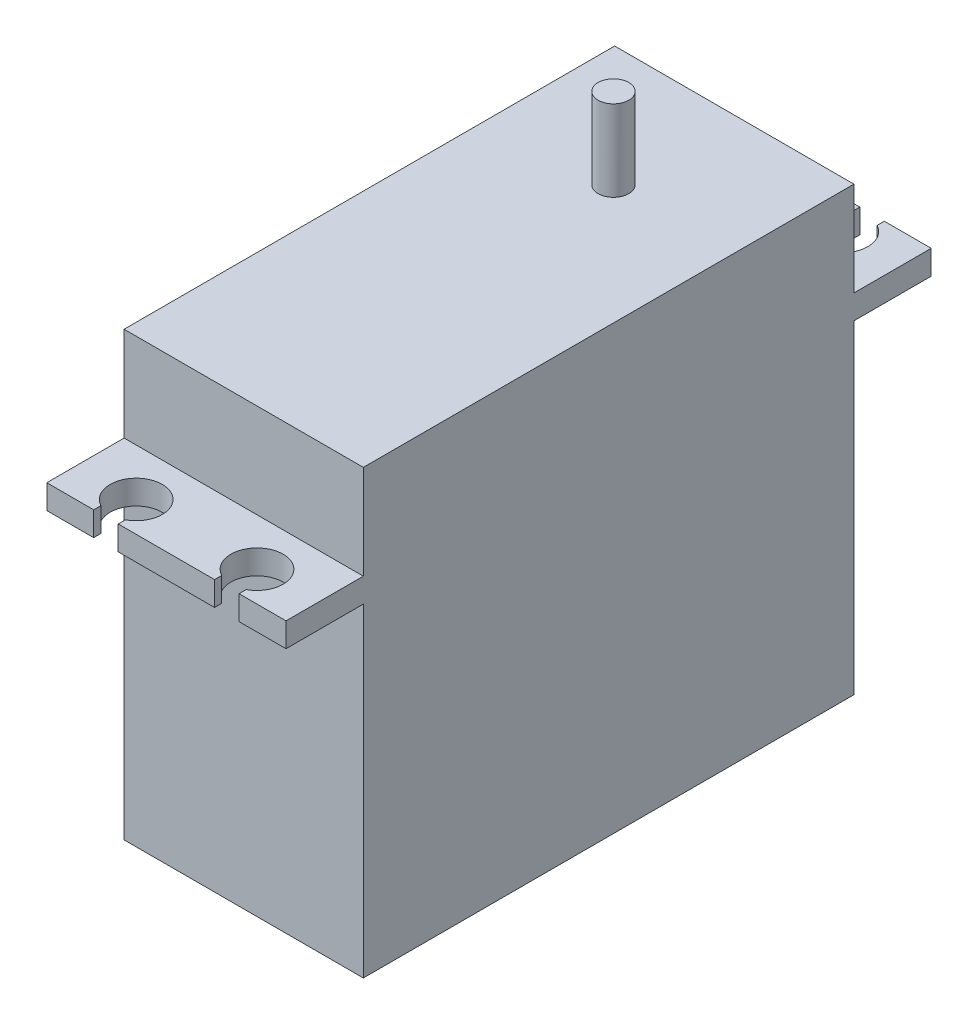
ISO-10303-21;
HEADER;
FILE_DESCRIPTION(('STEP AP214'),'2;1');
FILE_NAME('part.step','',(''),(''),'','','');
FILE_SCHEMA(('AUTOMOTIVE_DESIGN { 1 0 10303 214 1 1 1 1 }'));
ENDSEC;
DATA;
#1=APPLICATION_CONTEXT('core data for automotive mechanical design processes');
#2=APPLICATION_PROTOCOL_DEFINITION('international standard','automotive_design',2000,#1);
#3=PRODUCT_CONTEXT('',#1,'mechanical');
#4=PRODUCT('Part','Part','',(#3));
#5=PRODUCT_RELATED_PRODUCT_CATEGORY('part','',(#4));
#6=PRODUCT_DEFINITION_FORMATION('','',#4);
#7=PRODUCT_DEFINITION_CONTEXT('part definition',#1,'design');
#8=PRODUCT_DEFINITION('design','',#6,#7);
#9=PRODUCT_DEFINITION_SHAPE('','',#8);
#10=(LENGTH_UNIT() NAMED_UNIT(*) SI_UNIT(.MILLI.,.METRE.));
#11=(NAMED_UNIT(*) PLANE_ANGLE_UNIT() SI_UNIT($,.RADIAN.));
#12=(NAMED_UNIT(*) SI_UNIT($,.STERADIAN.) SOLID_ANGLE_UNIT());
#13=UNCERTAINTY_MEASURE_WITH_UNIT(LENGTH_MEASURE(1.E-05),#10,'distance_accuracy_value','');
#14=(GEOMETRIC_REPRESENTATION_CONTEXT(3) GLOBAL_UNCERTAINTY_ASSIGNED_CONTEXT((#13)) GLOBAL_UNIT_ASSIGNED_CONTEXT((#10,
#11,#12)) REPRESENTATION_CONTEXT('',''));
#15=CARTESIAN_POINT('',(0.,0.,0.));
#16=DIRECTION('',(0.,0.,1.));
#17=DIRECTION('',(1.,0.,0.));
#18=AXIS2_PLACEMENT_3D('',#15,#16,#17);
#19=CARTESIAN_POINT('',(0.,0.,-26.7));
#20=DIRECTION('',(0.,0.,-1.));
#21=DIRECTION('',(-1.,0.,0.));
#22=AXIS2_PLACEMENT_3D('',#19,#20,#21);
#23=PLANE('',#22);
#24=DIRECTION('',(0.,1.,0.));
#25=VECTOR('',#24,1.);
#26=CARTESIAN_POINT('',(3.984,0.,-26.7));
#27=LINE('',#26,#25);
#28=CARTESIAN_POINT('',(3.984,26.8,-26.7));
#29=VERTEX_POINT('',#28);
#30=CARTESIAN_POINT('',(3.984,28.8,-26.7));
#31=VERTEX_POINT('',#30);
#32=EDGE_CURVE('E42',#29,#31,#27,.T.);
#33=ORIENTED_EDGE('',*,*,#32,.F.);
#34=DIRECTION('',(-1.,0.,0.));
#35=VECTOR('',#34,1.);
#36=CARTESIAN_POINT('',(9.9,26.8,-26.7));
#37=LINE('',#36,#35);
#38=CARTESIAN_POINT('',(-3.984,26.8,-26.7));
#39=VERTEX_POINT('',#38);
#40=EDGE_CURVE('E335',#29,#39,#37,.T.);
#41=ORIENTED_EDGE('',*,*,#40,.T.);
#42=DIRECTION('',(0.,-1.,0.));
#43=VECTOR('',#42,1.);
#44=CARTESIAN_POINT('',(-3.984,0.,-26.7));
#45=LINE('',#44,#43);
#46=CARTESIAN_POINT('',(-3.984,28.8,-26.7));
#47=VERTEX_POINT('',#46);
#48=EDGE_CURVE('E399',#47,#39,#45,.T.);
#49=ORIENTED_EDGE('',*,*,#48,.F.);
#50=DIRECTION('',(1.,0.,0.));
#51=VECTOR('',#50,1.);
#52=CARTESIAN_POINT('',(9.9,28.8,-26.7));
#53=LINE('',#52,#51);
#54=EDGE_CURVE('E342',#47,#31,#53,.T.);
#55=ORIENTED_EDGE('',*,*,#54,.T.);
#56=EDGE_LOOP('',(#33,#41,#49,#55));
#57=FACE_BOUND('',#56,.T.);
#58=ADVANCED_FACE('F34',(#57),#23,.T.);
#59=CARTESIAN_POINT('',(0.,0.,26.7));
#60=DIRECTION('',(0.,0.,1.));
#61=DIRECTION('',(1.,0.,0.));
#62=AXIS2_PLACEMENT_3D('',#59,#60,#61);
#63=PLANE('',#62);
#64=DIRECTION('',(0.,1.,0.));
#65=VECTOR('',#64,1.);
#66=CARTESIAN_POINT('',(-3.984,0.,26.7));
#67=LINE('',#66,#65);
#68=CARTESIAN_POINT('',(-3.984,26.8,26.7));
#69=VERTEX_POINT('',#68);
#70=CARTESIAN_POINT('',(-3.984,28.8,26.7));
#71=VERTEX_POINT('',#70);
#72=EDGE_CURVE('E412',#69,#71,#67,.T.);
#73=ORIENTED_EDGE('',*,*,#72,.F.);
#74=DIRECTION('',(1.,0.,0.));
#75=VECTOR('',#74,1.);
#76=CARTESIAN_POINT('',(-9.9,26.8,26.7));
#77=LINE('',#76,#75);
#78=CARTESIAN_POINT('',(3.984,26.8,26.7));
#79=VERTEX_POINT('',#78);
#80=EDGE_CURVE('E302',#69,#79,#77,.T.);
#81=ORIENTED_EDGE('',*,*,#80,.T.);
#82=DIRECTION('',(0.,-1.,0.));
#83=VECTOR('',#82,1.);
#84=CARTESIAN_POINT('',(3.984,0.,26.7));
#85=LINE('',#84,#83);
#86=CARTESIAN_POINT('',(3.984,28.8,26.7));
#87=VERTEX_POINT('',#86);
#88=EDGE_CURVE('E227',#87,#79,#85,.T.);
#89=ORIENTED_EDGE('',*,*,#88,.F.);
#90=DIRECTION('',(-1.,0.,0.));
#91=VECTOR('',#90,1.);
#92=CARTESIAN_POINT('',(-9.9,28.8,26.7));
#93=LINE('',#92,#91);
#94=EDGE_CURVE('E309',#87,#71,#93,.T.);
#95=ORIENTED_EDGE('',*,*,#94,.T.);
#96=EDGE_LOOP('',(#73,#81,#89,#95));
#97=FACE_BOUND('',#96,.T.);
#98=ADVANCED_FACE('F474',(#97),#63,.T.);
#99=DIRECTION('',(0.,1.,0.));
#100=VECTOR('',#99,1.);
#101=CARTESIAN_POINT('',(6.016,0.,26.7));
#102=LINE('',#101,#100);
#103=CARTESIAN_POINT('',(6.016,26.8,26.7));
#104=VERTEX_POINT('',#103);
#105=CARTESIAN_POINT('',(6.016,28.8,26.7));
#106=VERTEX_POINT('',#105);
#107=EDGE_CURVE('E408',#104,#106,#102,.T.);
#108=ORIENTED_EDGE('',*,*,#107,.F.);
#109=CARTESIAN_POINT('',(9.9,26.8,26.7));
#110=VERTEX_POINT('',#109);
#111=EDGE_CURVE('E296',#104,#110,#77,.T.);
#112=ORIENTED_EDGE('',*,*,#111,.T.);
#113=DIRECTION('',(0.,1.,0.));
#114=VECTOR('',#113,1.);
#115=CARTESIAN_POINT('',(9.9,28.8,26.7));
#116=LINE('',#115,#114);
#117=CARTESIAN_POINT('',(9.9,28.8,26.7));
#118=VERTEX_POINT('',#117);
#119=EDGE_CURVE('E301',#110,#118,#116,.T.);
#120=ORIENTED_EDGE('',*,*,#119,.T.);
#121=EDGE_CURVE('E305',#118,#106,#93,.T.);
#122=ORIENTED_EDGE('',*,*,#121,.T.);
#123=EDGE_LOOP('',(#108,#112,#120,#122));
#124=FACE_BOUND('',#123,.T.);
#125=ADVANCED_FACE('F493',(#124),#63,.T.);
#126=DIRECTION('',(0.,1.,0.));
#127=VECTOR('',#126,1.);
#128=CARTESIAN_POINT('',(-6.016,0.,-26.7));
#129=LINE('',#128,#127);
#130=CARTESIAN_POINT('',(-6.016,26.8,-26.7));
#131=VERTEX_POINT('',#130);
#132=CARTESIAN_POINT('',(-6.016,28.8,-26.7));
#133=VERTEX_POINT('',#132);
#134=EDGE_CURVE('E402',#131,#133,#129,.T.);
#135=ORIENTED_EDGE('',*,*,#134,.F.);
#136=CARTESIAN_POINT('',(-9.9,26.8,-26.7));
#137=VERTEX_POINT('',#136);
#138=EDGE_CURVE('E329',#131,#137,#37,.T.);
#139=ORIENTED_EDGE('',*,*,#138,.T.);
#140=DIRECTION('',(0.,1.,0.));
#141=VECTOR('',#140,1.);
#142=CARTESIAN_POINT('',(-9.9,28.8,-26.7));
#143=LINE('',#142,#141);
#144=CARTESIAN_POINT('',(-9.9,28.8,-26.7));
#145=VERTEX_POINT('',#144);
#146=EDGE_CURVE('E334',#137,#145,#143,.T.);
#147=ORIENTED_EDGE('',*,*,#146,.T.);
#148=EDGE_CURVE('E338',#145,#133,#53,.T.);
#149=ORIENTED_EDGE('',*,*,#148,.T.);
#150=EDGE_LOOP('',(#135,#139,#147,#149));
#151=FACE_BOUND('',#150,.T.);
#152=ADVANCED_FACE('F513',(#151),#23,.T.);
#153=CARTESIAN_POINT('',(-9.9,36.6,20.3));
#154=DIRECTION('',(0.,0.,-1.));
#155=DIRECTION('',(-1.,0.,0.));
#156=AXIS2_PLACEMENT_3D('',#153,#154,#155);
#157=PLANE('',#156);
#158=DIRECTION('',(-1.,0.,0.));
#159=VECTOR('',#158,1.);
#160=CARTESIAN_POINT('',(-9.9,28.8,20.3));
#161=LINE('',#160,#159);
#162=CARTESIAN_POINT('',(9.9,28.8,20.3));
#163=VERTEX_POINT('',#162);
#164=CARTESIAN_POINT('',(-9.9,28.8,20.3));
#165=VERTEX_POINT('',#164);
#166=EDGE_CURVE('E297',#163,#165,#161,.T.);
#167=ORIENTED_EDGE('',*,*,#166,.F.);
#168=DIRECTION('',(0.,-1.,0.));
#169=VECTOR('',#168,1.);
#170=CARTESIAN_POINT('',(9.9,36.6,20.3));
#171=LINE('',#170,#169);
#172=CARTESIAN_POINT('',(9.9,36.6,20.3));
#173=VERTEX_POINT('',#172);
#174=EDGE_CURVE('E383',#173,#163,#171,.T.);
#175=ORIENTED_EDGE('',*,*,#174,.F.);
#176=DIRECTION('',(1.,0.,0.));
#177=VECTOR('',#176,1.);
#178=CARTESIAN_POINT('',(-9.9,36.6,20.3));
#179=LINE('',#178,#177);
#180=CARTESIAN_POINT('',(-9.9,36.6,20.3));
#181=VERTEX_POINT('',#180);
#182=EDGE_CURVE('E370',#181,#173,#179,.T.);
#183=ORIENTED_EDGE('',*,*,#182,.F.);
#184=DIRECTION('',(0.,-1.,0.));
#185=VECTOR('',#184,1.);
#186=CARTESIAN_POINT('',(-9.9,36.6,20.3));
#187=LINE('',#186,#185);
#188=EDGE_CURVE('E387',#181,#165,#187,.T.);
#189=ORIENTED_EDGE('',*,*,#188,.T.);
#190=EDGE_LOOP('',(#167,#175,#183,#189));
#191=FACE_BOUND('',#190,.T.);
#192=ADVANCED_FACE('F521',(#191),#157,.F.);
#193=DIRECTION('',(1.,0.,0.));
#194=VECTOR('',#193,1.);
#195=CARTESIAN_POINT('',(-9.9,26.8,20.3));
#196=LINE('',#195,#194);
#197=CARTESIAN_POINT('',(-9.9,26.8,20.3));
#198=VERTEX_POINT('',#197);
#199=CARTESIAN_POINT('',(9.9,26.8,20.3));
#200=VERTEX_POINT('',#199);
#201=EDGE_CURVE('E292',#198,#200,#196,.T.);
#202=ORIENTED_EDGE('',*,*,#201,.F.);
#203=CARTESIAN_POINT('',(-9.9,0.,20.3));
#204=VERTEX_POINT('',#203);
#205=EDGE_CURVE('E386',#198,#204,#187,.T.);
#206=ORIENTED_EDGE('',*,*,#205,.T.);
#207=DIRECTION('',(1.,0.,0.));
#208=VECTOR('',#207,1.);
#209=CARTESIAN_POINT('',(-9.9,0.,20.3));
#210=LINE('',#209,#208);
#211=CARTESIAN_POINT('',(9.9,0.,20.3));
#212=VERTEX_POINT('',#211);
#213=EDGE_CURVE('E366',#204,#212,#210,.T.);
#214=ORIENTED_EDGE('',*,*,#213,.T.);
#215=EDGE_CURVE('E372',#200,#212,#171,.T.);
#216=ORIENTED_EDGE('',*,*,#215,.F.);
#217=EDGE_LOOP('',(#202,#206,#214,#216));
#218=FACE_BOUND('',#217,.T.);
#219=ADVANCED_FACE('F551',(#218),#157,.F.);
#220=CARTESIAN_POINT('',(-9.9,36.6,-20.3));
#221=DIRECTION('',(0.,0.,1.));
#222=DIRECTION('',(1.,0.,0.));
#223=AXIS2_PLACEMENT_3D('',#220,#221,#222);
#224=PLANE('',#223);
#225=DIRECTION('',(1.,0.,0.));
#226=VECTOR('',#225,1.);
#227=CARTESIAN_POINT('',(9.9,28.8,-20.3));
#228=LINE('',#227,#226);
#229=CARTESIAN_POINT('',(-9.9,28.8,-20.3));
#230=VERTEX_POINT('',#229);
#231=CARTESIAN_POINT('',(9.9,28.8,-20.3));
#232=VERTEX_POINT('',#231);
#233=EDGE_CURVE('E330',#230,#232,#228,.T.);
#234=ORIENTED_EDGE('',*,*,#233,.F.);
#235=DIRECTION('',(0.,-1.,0.));
#236=VECTOR('',#235,1.);
#237=CARTESIAN_POINT('',(-9.9,36.6,-20.3));
#238=LINE('',#237,#236);
#239=CARTESIAN_POINT('',(-9.9,36.6,-20.3));
#240=VERTEX_POINT('',#239);
#241=EDGE_CURVE('E390',#240,#230,#238,.T.);
#242=ORIENTED_EDGE('',*,*,#241,.F.);
#243=DIRECTION('',(-1.,0.,0.));
#244=VECTOR('',#243,1.);
#245=CARTESIAN_POINT('',(-9.9,36.6,-20.3));
#246=LINE('',#245,#244);
#247=CARTESIAN_POINT('',(9.9,36.6,-20.3));
#248=VERTEX_POINT('',#247);
#249=EDGE_CURVE('E365',#248,#240,#246,.T.);
#250=ORIENTED_EDGE('',*,*,#249,.F.);
#251=DIRECTION('',(0.,-1.,0.));
#252=VECTOR('',#251,1.);
#253=CARTESIAN_POINT('',(9.9,36.6,-20.3));
#254=LINE('',#253,#252);
#255=EDGE_CURVE('E394',#248,#232,#254,.T.);
#256=ORIENTED_EDGE('',*,*,#255,.T.);
#257=EDGE_LOOP('',(#234,#242,#250,#256));
#258=FACE_BOUND('',#257,.T.);
#259=ADVANCED_FACE('F554',(#258),#224,.F.);
#260=DIRECTION('',(-1.,0.,0.));
#261=VECTOR('',#260,1.);
#262=CARTESIAN_POINT('',(9.9,26.8,-20.3));
#263=LINE('',#262,#261);
#264=CARTESIAN_POINT('',(9.9,26.8,-20.3));
#265=VERTEX_POINT('',#264);
#266=CARTESIAN_POINT('',(-9.9,26.8,-20.3));
#267=VERTEX_POINT('',#266);
#268=EDGE_CURVE('E325',#265,#267,#263,.T.);
#269=ORIENTED_EDGE('',*,*,#268,.F.);
#270=CARTESIAN_POINT('',(9.9,0.,-20.3));
#271=VERTEX_POINT('',#270);
#272=EDGE_CURVE('E393',#265,#271,#254,.T.);
#273=ORIENTED_EDGE('',*,*,#272,.T.);
#274=DIRECTION('',(-1.,0.,0.));
#275=VECTOR('',#274,1.);
#276=CARTESIAN_POINT('',(-9.9,0.,-20.3));
#277=LINE('',#276,#275);
#278=CARTESIAN_POINT('',(-9.9,0.,-20.3));
#279=VERTEX_POINT('',#278);
#280=EDGE_CURVE('E375',#271,#279,#277,.T.);
#281=ORIENTED_EDGE('',*,*,#280,.T.);
#282=EDGE_CURVE('E389',#267,#279,#238,.T.);
#283=ORIENTED_EDGE('',*,*,#282,.F.);
#284=EDGE_LOOP('',(#269,#273,#281,#283));
#285=FACE_BOUND('',#284,.T.);
#286=ADVANCED_FACE('F556',(#285),#224,.F.);
#287=CARTESIAN_POINT('',(9.9,36.6,20.3));
#288=DIRECTION('',(-1.,0.,0.));
#289=DIRECTION('',(0.,0.,1.));
#290=AXIS2_PLACEMENT_3D('',#287,#288,#289);
#291=PLANE('',#290);
#292=DIRECTION('',(0.,0.,-1.));
#293=VECTOR('',#292,1.);
#294=CARTESIAN_POINT('',(9.9,0.,20.3));
#295=LINE('',#294,#293);
#296=EDGE_CURVE('E361',#212,#271,#295,.T.);
#297=ORIENTED_EDGE('',*,*,#296,.T.);
#298=ORIENTED_EDGE('',*,*,#272,.F.);
#299=DIRECTION('',(0.,0.,1.));
#300=VECTOR('',#299,1.);
#301=CARTESIAN_POINT('',(9.9,26.8,-26.7));
#302=LINE('',#301,#300);
#303=CARTESIAN_POINT('',(9.9,26.8,-26.7));
#304=VERTEX_POINT('',#303);
#305=EDGE_CURVE('E355',#304,#265,#302,.T.);
#306=ORIENTED_EDGE('',*,*,#305,.F.);
#307=DIRECTION('',(0.,-1.,0.));
#308=VECTOR('',#307,1.);
#309=CARTESIAN_POINT('',(9.9,28.8,-26.7));
#310=LINE('',#309,#308);
#311=CARTESIAN_POINT('',(9.9,28.8,-26.7));
#312=VERTEX_POINT('',#311);
#313=EDGE_CURVE('E326',#312,#304,#310,.T.);
#314=ORIENTED_EDGE('',*,*,#313,.F.);
#315=DIRECTION('',(0.,0.,1.));
#316=VECTOR('',#315,1.);
#317=CARTESIAN_POINT('',(9.9,28.8,-26.7));
#318=LINE('',#317,#316);
#319=EDGE_CURVE('E341',#312,#232,#318,.T.);
#320=ORIENTED_EDGE('',*,*,#319,.T.);
#321=ORIENTED_EDGE('',*,*,#255,.F.);
#322=DIRECTION('',(0.,0.,-1.));
#323=VECTOR('',#322,1.);
#324=CARTESIAN_POINT('',(9.9,36.6,20.3));
#325=LINE('',#324,#323);
#326=EDGE_CURVE('E362',#173,#248,#325,.T.);
#327=ORIENTED_EDGE('',*,*,#326,.F.);
#328=ORIENTED_EDGE('',*,*,#174,.T.);
#329=DIRECTION('',(0.,0.,-1.));
#330=VECTOR('',#329,1.);
#331=CARTESIAN_POINT('',(9.9,28.8,26.7));
#332=LINE('',#331,#330);
#333=EDGE_CURVE('E316',#118,#163,#332,.T.);
#334=ORIENTED_EDGE('',*,*,#333,.F.);
#335=ORIENTED_EDGE('',*,*,#119,.F.);
#336=DIRECTION('',(0.,0.,-1.));
#337=VECTOR('',#336,1.);
#338=CARTESIAN_POINT('',(9.9,26.8,26.7));
#339=LINE('',#338,#337);
#340=EDGE_CURVE('E319',#110,#200,#339,.T.);
#341=ORIENTED_EDGE('',*,*,#340,.T.);
#342=ORIENTED_EDGE('',*,*,#215,.T.);
#343=EDGE_LOOP('',(#297,#298,#306,#314,#320,#321,#327,#328,#334,#335,#341,#342));
#344=FACE_BOUND('',#343,.T.);
#345=ADVANCED_FACE('F36',(#344),#291,.F.);
#346=CARTESIAN_POINT('',(-9.9,36.6,20.3));
#347=DIRECTION('',(1.,0.,0.));
#348=DIRECTION('',(0.,0.,-1.));
#349=AXIS2_PLACEMENT_3D('',#346,#347,#348);
#350=PLANE('',#349);
#351=DIRECTION('',(0.,0.,1.));
#352=VECTOR('',#351,1.);
#353=CARTESIAN_POINT('',(-9.9,0.,20.3));
#354=LINE('',#353,#352);
#355=EDGE_CURVE('E378',#279,#204,#354,.T.);
#356=ORIENTED_EDGE('',*,*,#355,.T.);
#357=ORIENTED_EDGE('',*,*,#205,.F.);
#358=DIRECTION('',(0.,0.,-1.));
#359=VECTOR('',#358,1.);
#360=CARTESIAN_POINT('',(-9.9,26.8,26.7));
#361=LINE('',#360,#359);
#362=CARTESIAN_POINT('',(-9.9,26.8,26.7));
#363=VERTEX_POINT('',#362);
#364=EDGE_CURVE('E322',#363,#198,#361,.T.);
#365=ORIENTED_EDGE('',*,*,#364,.F.);
#366=DIRECTION('',(0.,-1.,0.));
#367=VECTOR('',#366,1.);
#368=CARTESIAN_POINT('',(-9.9,28.8,26.7));
#369=LINE('',#368,#367);
#370=CARTESIAN_POINT('',(-9.9,28.8,26.7));
#371=VERTEX_POINT('',#370);
#372=EDGE_CURVE('E293',#371,#363,#369,.T.);
#373=ORIENTED_EDGE('',*,*,#372,.F.);
#374=DIRECTION('',(0.,0.,-1.));
#375=VECTOR('',#374,1.);
#376=CARTESIAN_POINT('',(-9.9,28.8,26.7));
#377=LINE('',#376,#375);
#378=EDGE_CURVE('E308',#371,#165,#377,.T.);
#379=ORIENTED_EDGE('',*,*,#378,.T.);
#380=ORIENTED_EDGE('',*,*,#188,.F.);
#381=DIRECTION('',(0.,0.,1.));
#382=VECTOR('',#381,1.);
#383=CARTESIAN_POINT('',(-9.9,36.6,20.3));
#384=LINE('',#383,#382);
#385=EDGE_CURVE('E368',#240,#181,#384,.T.);
#386=ORIENTED_EDGE('',*,*,#385,.F.);
#387=ORIENTED_EDGE('',*,*,#241,.T.);
#388=DIRECTION('',(0.,0.,1.));
#389=VECTOR('',#388,1.);
#390=CARTESIAN_POINT('',(-9.9,28.8,-26.7));
#391=LINE('',#390,#389);
#392=EDGE_CURVE('E349',#145,#230,#391,.T.);
#393=ORIENTED_EDGE('',*,*,#392,.F.);
#394=ORIENTED_EDGE('',*,*,#146,.F.);
#395=DIRECTION('',(0.,0.,1.));
#396=VECTOR('',#395,1.);
#397=CARTESIAN_POINT('',(-9.9,26.8,-26.7));
#398=LINE('',#397,#396);
#399=EDGE_CURVE('E352',#137,#267,#398,.T.);
#400=ORIENTED_EDGE('',*,*,#399,.T.);
#401=ORIENTED_EDGE('',*,*,#282,.T.);
#402=EDGE_LOOP('',(#356,#357,#365,#373,#379,#380,#386,#387,#393,#394,#400,#401));
#403=FACE_BOUND('',#402,.T.);
#404=ADVANCED_FACE('F483',(#403),#350,.F.);
#405=CARTESIAN_POINT('',(0.,36.6,0.));
#406=DIRECTION('',(0.,-1.,0.));
#407=DIRECTION('',(0.,0.,-1.));
#408=AXIS2_PLACEMENT_3D('',#405,#406,#407);
#409=PLANE('',#408);
#410=CARTESIAN_POINT('',(0.,36.6,-10.3));
#411=DIRECTION('',(0.,-1.,0.));
#412=DIRECTION('',(0.,0.,-1.));
#413=AXIS2_PLACEMENT_3D('',#410,#411,#412);
#414=CIRCLE('',#413,1.27);
#415=CARTESIAN_POINT('',(0.,36.6,-11.57));
#416=VERTEX_POINT('',#415);
#417=EDGE_CURVE('E396',#416,#416,#414,.F.);
#418=ORIENTED_EDGE('',*,*,#417,.F.);
#419=EDGE_LOOP('',(#418));
#420=FACE_BOUND('',#419,.T.);
#421=ORIENTED_EDGE('',*,*,#326,.T.);
#422=ORIENTED_EDGE('',*,*,#249,.T.);
#423=ORIENTED_EDGE('',*,*,#385,.T.);
#424=ORIENTED_EDGE('',*,*,#182,.T.);
#425=EDGE_LOOP('',(#421,#422,#423,#424));
#426=FACE_BOUND('',#425,.T.);
#427=ADVANCED_FACE('F542',(#420,#426),#409,.F.);
#428=CARTESIAN_POINT('',(0.,0.,0.));
#429=DIRECTION('',(0.,-1.,0.));
#430=DIRECTION('',(0.,0.,-1.));
#431=AXIS2_PLACEMENT_3D('',#428,#429,#430);
#432=PLANE('',#431);
#433=ORIENTED_EDGE('',*,*,#296,.F.);
#434=ORIENTED_EDGE('',*,*,#213,.F.);
#435=ORIENTED_EDGE('',*,*,#355,.F.);
#436=ORIENTED_EDGE('',*,*,#280,.F.);
#437=EDGE_LOOP('',(#433,#434,#435,#436));
#438=FACE_BOUND('',#437,.T.);
#439=ADVANCED_FACE('F540',(#438),#432,.T.);
#440=CARTESIAN_POINT('',(0.,43.300000022,-10.3));
#441=DIRECTION('',(0.,-1.,0.));
#442=DIRECTION('',(0.,0.,-1.));
#443=AXIS2_PLACEMENT_3D('',#440,#441,#442);
#444=CYLINDRICAL_SURFACE('',#443,1.27);
#445=CARTESIAN_POINT('',(0.,43.300000022,-10.3));
#446=DIRECTION('',(0.,1.,0.));
#447=DIRECTION('',(0.,0.,1.));
#448=AXIS2_PLACEMENT_3D('',#445,#446,#447);
#449=CIRCLE('',#448,1.27);
#450=CARTESIAN_POINT('',(0.,43.300000022,-9.03000000000001));
#451=VERTEX_POINT('',#450);
#452=EDGE_CURVE('E358',#451,#451,#449,.T.);
#453=ORIENTED_EDGE('',*,*,#452,.F.);
#454=EDGE_LOOP('',(#453));
#455=FACE_BOUND('',#454,.T.);
#456=ORIENTED_EDGE('',*,*,#417,.T.);
#457=EDGE_LOOP('',(#456));
#458=FACE_BOUND('',#457,.T.);
#459=ADVANCED_FACE('F536',(#455,#458),#444,.T.);
#460=CARTESIAN_POINT('',(0.,43.300000022,-10.3));
#461=DIRECTION('',(0.,1.,0.));
#462=DIRECTION('',(0.,0.,1.));
#463=AXIS2_PLACEMENT_3D('',#460,#461,#462);
#464=PLANE('',#463);
#465=ORIENTED_EDGE('',*,*,#452,.T.);
#466=EDGE_LOOP('',(#465));
#467=FACE_BOUND('',#466,.T.);
#468=ADVANCED_FACE('F531',(#467),#464,.T.);
#469=CARTESIAN_POINT('',(9.9,26.8,-26.7));
#470=DIRECTION('',(0.,1.,0.));
#471=DIRECTION('',(0.,0.,1.));
#472=AXIS2_PLACEMENT_3D('',#469,#470,#471);
#473=PLANE('',#472);
#474=ORIENTED_EDGE('',*,*,#40,.F.);
#475=DIRECTION('',(0.,0.,1.));
#476=VECTOR('',#475,1.);
#477=CARTESIAN_POINT('',(3.984,26.8,-26.7));
#478=LINE('',#477,#476);
#479=CARTESIAN_POINT('',(3.984,26.8,-26.105));
#480=VERTEX_POINT('',#479);
#481=EDGE_CURVE('E265',#29,#480,#478,.T.);
#482=ORIENTED_EDGE('',*,*,#481,.T.);
#483=CARTESIAN_POINT('',(5.,26.8,-24.2));
#484=DIRECTION('',(0.,1.,0.));
#485=DIRECTION('',(0.,0.,1.));
#486=AXIS2_PLACEMENT_3D('',#483,#484,#485);
#487=CIRCLE('',#486,2.159);
#488=CARTESIAN_POINT('',(6.016,26.8,-26.105));
#489=VERTEX_POINT('',#488);
#490=EDGE_CURVE('E268',#480,#489,#487,.T.);
#491=ORIENTED_EDGE('',*,*,#490,.T.);
#492=DIRECTION('',(0.,0.,-1.));
#493=VECTOR('',#492,1.);
#494=CARTESIAN_POINT('',(6.016,26.8,-26.7));
#495=LINE('',#494,#493);
#496=CARTESIAN_POINT('',(6.016,26.8,-26.7));
#497=VERTEX_POINT('',#496);
#498=EDGE_CURVE('E259',#489,#497,#495,.T.);
#499=ORIENTED_EDGE('',*,*,#498,.T.);
#500=EDGE_CURVE('E331',#304,#497,#37,.T.);
#501=ORIENTED_EDGE('',*,*,#500,.F.);
#502=ORIENTED_EDGE('',*,*,#305,.T.);
#503=ORIENTED_EDGE('',*,*,#268,.T.);
#504=ORIENTED_EDGE('',*,*,#399,.F.);
#505=ORIENTED_EDGE('',*,*,#138,.F.);
#506=DIRECTION('',(0.,0.,1.));
#507=VECTOR('',#506,1.);
#508=CARTESIAN_POINT('',(-6.016,26.8,-26.7));
#509=LINE('',#508,#507);
#510=CARTESIAN_POINT('',(-6.016,26.8,-26.105));
#511=VERTEX_POINT('',#510);
#512=EDGE_CURVE('E286',#131,#511,#509,.T.);
#513=ORIENTED_EDGE('',*,*,#512,.T.);
#514=CARTESIAN_POINT('',(-5.,26.8,-24.2));
#515=DIRECTION('',(0.,1.,0.));
#516=DIRECTION('',(0.,0.,1.));
#517=AXIS2_PLACEMENT_3D('',#514,#515,#516);
#518=CIRCLE('',#517,2.159);
#519=CARTESIAN_POINT('',(-3.984,26.8,-26.105));
#520=VERTEX_POINT('',#519);
#521=EDGE_CURVE('E289',#511,#520,#518,.T.);
#522=ORIENTED_EDGE('',*,*,#521,.T.);
#523=DIRECTION('',(0.,0.,-1.));
#524=VECTOR('',#523,1.);
#525=CARTESIAN_POINT('',(-3.984,26.8,-26.7));
#526=LINE('',#525,#524);
#527=EDGE_CURVE('E280',#520,#39,#526,.T.);
#528=ORIENTED_EDGE('',*,*,#527,.T.);
#529=EDGE_LOOP('',(#474,#482,#491,#499,#501,#502,#503,#504,#505,#513,#522,#528));
#530=FACE_BOUND('',#529,.T.);
#531=ADVANCED_FACE('F441',(#530),#473,.F.);
#532=CARTESIAN_POINT('',(9.9,28.8,-26.7));
#533=DIRECTION('',(0.,-1.,0.));
#534=DIRECTION('',(0.,0.,-1.));
#535=AXIS2_PLACEMENT_3D('',#532,#533,#534);
#536=PLANE('',#535);
#537=CARTESIAN_POINT('',(5.,28.8,-24.2));
#538=DIRECTION('',(0.,-1.,0.));
#539=DIRECTION('',(0.,0.,-1.));
#540=AXIS2_PLACEMENT_3D('',#537,#538,#539);
#541=CIRCLE('',#540,2.159);
#542=CARTESIAN_POINT('',(6.016,28.8,-26.105));
#543=VERTEX_POINT('',#542);
#544=CARTESIAN_POINT('',(3.984,28.8,-26.105));
#545=VERTEX_POINT('',#544);
#546=EDGE_CURVE('E11',#543,#545,#541,.T.);
#547=ORIENTED_EDGE('',*,*,#546,.T.);
#548=DIRECTION('',(0.,0.,-1.));
#549=VECTOR('',#548,1.);
#550=CARTESIAN_POINT('',(3.984,28.8,-26.7));
#551=LINE('',#550,#549);
#552=EDGE_CURVE('E262',#545,#31,#551,.T.);
#553=ORIENTED_EDGE('',*,*,#552,.T.);
#554=ORIENTED_EDGE('',*,*,#54,.F.);
#555=DIRECTION('',(0.,0.,1.));
#556=VECTOR('',#555,1.);
#557=CARTESIAN_POINT('',(-3.984,28.8,-26.7));
#558=LINE('',#557,#556);
#559=CARTESIAN_POINT('',(-3.984,28.8,-26.105));
#560=VERTEX_POINT('',#559);
#561=EDGE_CURVE('E275',#47,#560,#558,.T.);
#562=ORIENTED_EDGE('',*,*,#561,.T.);
#563=CARTESIAN_POINT('',(-5.,28.8,-24.2));
#564=DIRECTION('',(0.,-1.,0.));
#565=DIRECTION('',(0.,0.,-1.));
#566=AXIS2_PLACEMENT_3D('',#563,#564,#565);
#567=CIRCLE('',#566,2.159);
#568=CARTESIAN_POINT('',(-6.016,28.8,-26.105));
#569=VERTEX_POINT('',#568);
#570=EDGE_CURVE('E404',#560,#569,#567,.T.);
#571=ORIENTED_EDGE('',*,*,#570,.T.);
#572=DIRECTION('',(0.,0.,-1.));
#573=VECTOR('',#572,1.);
#574=CARTESIAN_POINT('',(-6.016,28.8,-26.7));
#575=LINE('',#574,#573);
#576=EDGE_CURVE('E283',#569,#133,#575,.T.);
#577=ORIENTED_EDGE('',*,*,#576,.T.);
#578=ORIENTED_EDGE('',*,*,#148,.F.);
#579=ORIENTED_EDGE('',*,*,#392,.T.);
#580=ORIENTED_EDGE('',*,*,#233,.T.);
#581=ORIENTED_EDGE('',*,*,#319,.F.);
#582=CARTESIAN_POINT('',(6.016,28.8,-26.7));
#583=VERTEX_POINT('',#582);
#584=EDGE_CURVE('E337',#583,#312,#53,.T.);
#585=ORIENTED_EDGE('',*,*,#584,.F.);
#586=DIRECTION('',(0.,0.,1.));
#587=VECTOR('',#586,1.);
#588=CARTESIAN_POINT('',(6.016,28.8,-26.7));
#589=LINE('',#588,#587);
#590=EDGE_CURVE('E49',#583,#543,#589,.T.);
#591=ORIENTED_EDGE('',*,*,#590,.T.);
#592=EDGE_LOOP('',(#547,#553,#554,#562,#571,#577,#578,#579,#580,#581,#585,#591));
#593=FACE_BOUND('',#592,.T.);
#594=ADVANCED_FACE('F429',(#593),#536,.F.);
#595=DIRECTION('',(0.,-1.,0.));
#596=VECTOR('',#595,1.);
#597=CARTESIAN_POINT('',(6.016,0.,-26.7));
#598=LINE('',#597,#596);
#599=EDGE_CURVE('E418',#583,#497,#598,.T.);
#600=ORIENTED_EDGE('',*,*,#599,.F.);
#601=ORIENTED_EDGE('',*,*,#584,.T.);
#602=ORIENTED_EDGE('',*,*,#313,.T.);
#603=ORIENTED_EDGE('',*,*,#500,.T.);
#604=EDGE_LOOP('',(#600,#601,#602,#603));
#605=FACE_BOUND('',#604,.T.);
#606=ADVANCED_FACE('F434',(#605),#23,.T.);
#607=CARTESIAN_POINT('',(-9.9,26.8,26.7));
#608=DIRECTION('',(0.,1.,0.));
#609=DIRECTION('',(0.,0.,1.));
#610=AXIS2_PLACEMENT_3D('',#607,#608,#609);
#611=PLANE('',#610);
#612=ORIENTED_EDGE('',*,*,#80,.F.);
#613=DIRECTION('',(0.,0.,-1.));
#614=VECTOR('',#613,1.);
#615=CARTESIAN_POINT('',(-3.984,26.8,26.7));
#616=LINE('',#615,#614);
#617=CARTESIAN_POINT('',(-3.984,26.8,26.105));
#618=VERTEX_POINT('',#617);
#619=EDGE_CURVE('E249',#69,#618,#616,.T.);
#620=ORIENTED_EDGE('',*,*,#619,.T.);
#621=CARTESIAN_POINT('',(-5.,26.8,24.2));
#622=DIRECTION('',(0.,1.,0.));
#623=DIRECTION('',(0.,0.,1.));
#624=AXIS2_PLACEMENT_3D('',#621,#622,#623);
#625=CIRCLE('',#624,2.159);
#626=CARTESIAN_POINT('',(-6.016,26.8,26.105));
#627=VERTEX_POINT('',#626);
#628=EDGE_CURVE('E248',#618,#627,#625,.T.);
#629=ORIENTED_EDGE('',*,*,#628,.T.);
#630=DIRECTION('',(0.,0.,1.));
#631=VECTOR('',#630,1.);
#632=CARTESIAN_POINT('',(-6.016,26.8,26.7));
#633=LINE('',#632,#631);
#634=CARTESIAN_POINT('',(-6.016,26.8,26.7));
#635=VERTEX_POINT('',#634);
#636=EDGE_CURVE('E463',#627,#635,#633,.T.);
#637=ORIENTED_EDGE('',*,*,#636,.T.);
#638=EDGE_CURVE('E298',#363,#635,#77,.T.);
#639=ORIENTED_EDGE('',*,*,#638,.F.);
#640=ORIENTED_EDGE('',*,*,#364,.T.);
#641=ORIENTED_EDGE('',*,*,#201,.T.);
#642=ORIENTED_EDGE('',*,*,#340,.F.);
#643=ORIENTED_EDGE('',*,*,#111,.F.);
#644=DIRECTION('',(0.,0.,-1.));
#645=VECTOR('',#644,1.);
#646=CARTESIAN_POINT('',(6.016,26.8,26.7));
#647=LINE('',#646,#645);
#648=CARTESIAN_POINT('',(6.016,26.8,26.105));
#649=VERTEX_POINT('',#648);
#650=EDGE_CURVE('E247',#104,#649,#647,.T.);
#651=ORIENTED_EDGE('',*,*,#650,.T.);
#652=CARTESIAN_POINT('',(5.,26.8,24.2));
#653=DIRECTION('',(0.,1.,0.));
#654=DIRECTION('',(0.,0.,1.));
#655=AXIS2_PLACEMENT_3D('',#652,#653,#654);
#656=CIRCLE('',#655,2.159);
#657=CARTESIAN_POINT('',(3.984,26.8,26.105));
#658=VERTEX_POINT('',#657);
#659=EDGE_CURVE('E238',#649,#658,#656,.T.);
#660=ORIENTED_EDGE('',*,*,#659,.T.);
#661=DIRECTION('',(0.,0.,1.));
#662=VECTOR('',#661,1.);
#663=CARTESIAN_POINT('',(3.984,26.8,26.7));
#664=LINE('',#663,#662);
#665=EDGE_CURVE('E221',#658,#79,#664,.T.);
#666=ORIENTED_EDGE('',*,*,#665,.T.);
#667=EDGE_LOOP('',(#612,#620,#629,#637,#639,#640,#641,#642,#643,#651,#660,#666));
#668=FACE_BOUND('',#667,.T.);
#669=ADVANCED_FACE('F245',(#668),#611,.F.);
#670=CARTESIAN_POINT('',(-9.9,28.8,26.7));
#671=DIRECTION('',(0.,-1.,0.));
#672=DIRECTION('',(0.,0.,-1.));
#673=AXIS2_PLACEMENT_3D('',#670,#671,#672);
#674=PLANE('',#673);
#675=CARTESIAN_POINT('',(-5.,28.8,24.2));
#676=DIRECTION('',(0.,-1.,0.));
#677=DIRECTION('',(0.,0.,-1.));
#678=AXIS2_PLACEMENT_3D('',#675,#676,#677);
#679=CIRCLE('',#678,2.159);
#680=CARTESIAN_POINT('',(-6.016,28.8,26.105));
#681=VERTEX_POINT('',#680);
#682=CARTESIAN_POINT('',(-3.984,28.8,26.105));
#683=VERTEX_POINT('',#682);
#684=EDGE_CURVE('E415',#681,#683,#679,.T.);
#685=ORIENTED_EDGE('',*,*,#684,.T.);
#686=DIRECTION('',(0.,0.,1.));
#687=VECTOR('',#686,1.);
#688=CARTESIAN_POINT('',(-3.984,28.8,26.7));
#689=LINE('',#688,#687);
#690=EDGE_CURVE('E254',#683,#71,#689,.T.);
#691=ORIENTED_EDGE('',*,*,#690,.T.);
#692=ORIENTED_EDGE('',*,*,#94,.F.);
#693=DIRECTION('',(0.,0.,-1.));
#694=VECTOR('',#693,1.);
#695=CARTESIAN_POINT('',(3.984,28.8,26.7));
#696=LINE('',#695,#694);
#697=CARTESIAN_POINT('',(3.984,28.8,26.105));
#698=VERTEX_POINT('',#697);
#699=EDGE_CURVE('E233',#87,#698,#696,.T.);
#700=ORIENTED_EDGE('',*,*,#699,.T.);
#701=CARTESIAN_POINT('',(5.,28.8,24.2));
#702=DIRECTION('',(0.,-1.,0.));
#703=DIRECTION('',(0.,0.,-1.));
#704=AXIS2_PLACEMENT_3D('',#701,#702,#703);
#705=CIRCLE('',#704,2.159);
#706=CARTESIAN_POINT('',(6.016,28.8,26.105));
#707=VERTEX_POINT('',#706);
#708=EDGE_CURVE('E241',#698,#707,#705,.T.);
#709=ORIENTED_EDGE('',*,*,#708,.T.);
#710=DIRECTION('',(0.,0.,1.));
#711=VECTOR('',#710,1.);
#712=CARTESIAN_POINT('',(6.016,28.8,26.7));
#713=LINE('',#712,#711);
#714=EDGE_CURVE('E232',#707,#106,#713,.T.);
#715=ORIENTED_EDGE('',*,*,#714,.T.);
#716=ORIENTED_EDGE('',*,*,#121,.F.);
#717=ORIENTED_EDGE('',*,*,#333,.T.);
#718=ORIENTED_EDGE('',*,*,#166,.T.);
#719=ORIENTED_EDGE('',*,*,#378,.F.);
#720=CARTESIAN_POINT('',(-6.016,28.8,26.7));
#721=VERTEX_POINT('',#720);
#722=EDGE_CURVE('E304',#721,#371,#93,.T.);
#723=ORIENTED_EDGE('',*,*,#722,.F.);
#724=DIRECTION('',(0.,0.,-1.));
#725=VECTOR('',#724,1.);
#726=CARTESIAN_POINT('',(-6.016,28.8,26.7));
#727=LINE('',#726,#725);
#728=EDGE_CURVE('E57',#721,#681,#727,.T.);
#729=ORIENTED_EDGE('',*,*,#728,.T.);
#730=EDGE_LOOP('',(#685,#691,#692,#700,#709,#715,#716,#717,#718,#719,#723,#729));
#731=FACE_BOUND('',#730,.T.);
#732=ADVANCED_FACE('F469',(#731),#674,.F.);
#733=DIRECTION('',(0.,-1.,0.));
#734=VECTOR('',#733,1.);
#735=CARTESIAN_POINT('',(-6.016,0.,26.7));
#736=LINE('',#735,#734);
#737=EDGE_CURVE('E410',#721,#635,#736,.T.);
#738=ORIENTED_EDGE('',*,*,#737,.F.);
#739=ORIENTED_EDGE('',*,*,#722,.T.);
#740=ORIENTED_EDGE('',*,*,#372,.T.);
#741=ORIENTED_EDGE('',*,*,#638,.T.);
#742=EDGE_LOOP('',(#738,#739,#740,#741));
#743=FACE_BOUND('',#742,.T.);
#744=ADVANCED_FACE('F478',(#743),#63,.T.);
#745=CARTESIAN_POINT('',(-5.,0.,-24.2));
#746=DIRECTION('',(0.,1.,0.));
#747=DIRECTION('',(0.,0.,1.));
#748=AXIS2_PLACEMENT_3D('',#745,#746,#747);
#749=CYLINDRICAL_SURFACE('',#748,2.159);
#750=DIRECTION('',(0.,1.,0.));
#751=VECTOR('',#750,1.);
#752=CARTESIAN_POINT('',(-6.016,0.,-26.105));
#753=LINE('',#752,#751);
#754=EDGE_CURVE('E272',#511,#569,#753,.T.);
#755=ORIENTED_EDGE('',*,*,#754,.T.);
#756=ORIENTED_EDGE('',*,*,#570,.F.);
#757=DIRECTION('',(0.,1.,0.));
#758=VECTOR('',#757,1.);
#759=CARTESIAN_POINT('',(-3.984,0.,-26.105));
#760=LINE('',#759,#758);
#761=EDGE_CURVE('E271',#520,#560,#760,.T.);
#762=ORIENTED_EDGE('',*,*,#761,.F.);
#763=ORIENTED_EDGE('',*,*,#521,.F.);
#764=EDGE_LOOP('',(#755,#756,#762,#763));
#765=FACE_BOUND('',#764,.T.);
#766=ADVANCED_FACE('F575',(#765),#749,.F.);
#767=CARTESIAN_POINT('',(-6.016,0.,-26.105));
#768=DIRECTION('',(-1.,0.,0.));
#769=DIRECTION('',(0.,0.,1.));
#770=AXIS2_PLACEMENT_3D('',#767,#768,#769);
#771=PLANE('',#770);
#772=ORIENTED_EDGE('',*,*,#134,.T.);
#773=ORIENTED_EDGE('',*,*,#576,.F.);
#774=ORIENTED_EDGE('',*,*,#754,.F.);
#775=ORIENTED_EDGE('',*,*,#512,.F.);
#776=EDGE_LOOP('',(#772,#773,#774,#775));
#777=FACE_BOUND('',#776,.T.);
#778=ADVANCED_FACE('F577',(#777),#771,.F.);
#779=CARTESIAN_POINT('',(-3.984,0.,-26.105));
#780=DIRECTION('',(1.,0.,0.));
#781=DIRECTION('',(0.,0.,-1.));
#782=AXIS2_PLACEMENT_3D('',#779,#780,#781);
#783=PLANE('',#782);
#784=ORIENTED_EDGE('',*,*,#761,.T.);
#785=ORIENTED_EDGE('',*,*,#561,.F.);
#786=ORIENTED_EDGE('',*,*,#48,.T.);
#787=ORIENTED_EDGE('',*,*,#527,.F.);
#788=EDGE_LOOP('',(#784,#785,#786,#787));
#789=FACE_BOUND('',#788,.T.);
#790=ADVANCED_FACE('F508',(#789),#783,.F.);
#791=CARTESIAN_POINT('',(5.,0.,24.2));
#792=DIRECTION('',(0.,1.,0.));
#793=DIRECTION('',(0.,0.,1.));
#794=AXIS2_PLACEMENT_3D('',#791,#792,#793);
#795=CYLINDRICAL_SURFACE('',#794,2.159);
#796=DIRECTION('',(0.,1.,0.));
#797=VECTOR('',#796,1.);
#798=CARTESIAN_POINT('',(6.016,0.,26.105));
#799=LINE('',#798,#797);
#800=EDGE_CURVE('E242',#649,#707,#799,.T.);
#801=ORIENTED_EDGE('',*,*,#800,.T.);
#802=ORIENTED_EDGE('',*,*,#708,.F.);
#803=DIRECTION('',(0.,1.,0.));
#804=VECTOR('',#803,1.);
#805=CARTESIAN_POINT('',(3.984,0.,26.105));
#806=LINE('',#805,#804);
#807=EDGE_CURVE('E224',#658,#698,#806,.T.);
#808=ORIENTED_EDGE('',*,*,#807,.F.);
#809=ORIENTED_EDGE('',*,*,#659,.F.);
#810=EDGE_LOOP('',(#801,#802,#808,#809));
#811=FACE_BOUND('',#810,.T.);
#812=ADVANCED_FACE('F237',(#811),#795,.F.);
#813=CARTESIAN_POINT('',(6.016,0.,26.105));
#814=DIRECTION('',(1.,0.,0.));
#815=DIRECTION('',(0.,0.,-1.));
#816=AXIS2_PLACEMENT_3D('',#813,#814,#815);
#817=PLANE('',#816);
#818=ORIENTED_EDGE('',*,*,#107,.T.);
#819=ORIENTED_EDGE('',*,*,#714,.F.);
#820=ORIENTED_EDGE('',*,*,#800,.F.);
#821=ORIENTED_EDGE('',*,*,#650,.F.);
#822=EDGE_LOOP('',(#818,#819,#820,#821));
#823=FACE_BOUND('',#822,.T.);
#824=ADVANCED_FACE('F500',(#823),#817,.F.);
#825=CARTESIAN_POINT('',(3.984,0.,26.105));
#826=DIRECTION('',(-1.,0.,0.));
#827=DIRECTION('',(0.,0.,1.));
#828=AXIS2_PLACEMENT_3D('',#825,#826,#827);
#829=PLANE('',#828);
#830=ORIENTED_EDGE('',*,*,#807,.T.);
#831=ORIENTED_EDGE('',*,*,#699,.F.);
#832=ORIENTED_EDGE('',*,*,#88,.T.);
#833=ORIENTED_EDGE('',*,*,#665,.F.);
#834=EDGE_LOOP('',(#830,#831,#832,#833));
#835=FACE_BOUND('',#834,.T.);
#836=ADVANCED_FACE('F223',(#835),#829,.F.);
#837=CARTESIAN_POINT('',(-5.,0.,24.2));
#838=DIRECTION('',(0.,1.,0.));
#839=DIRECTION('',(0.,0.,1.));
#840=AXIS2_PLACEMENT_3D('',#837,#838,#839);
#841=CYLINDRICAL_SURFACE('',#840,2.159);
#842=DIRECTION('',(0.,1.,0.));
#843=VECTOR('',#842,1.);
#844=CARTESIAN_POINT('',(-3.984,0.,26.105));
#845=LINE('',#844,#843);
#846=EDGE_CURVE('E449',#618,#683,#845,.T.);
#847=ORIENTED_EDGE('',*,*,#846,.T.);
#848=ORIENTED_EDGE('',*,*,#684,.F.);
#849=DIRECTION('',(0.,1.,0.));
#850=VECTOR('',#849,1.);
#851=CARTESIAN_POINT('',(-6.016,0.,26.105));
#852=LINE('',#851,#850);
#853=EDGE_CURVE('E453',#627,#681,#852,.T.);
#854=ORIENTED_EDGE('',*,*,#853,.F.);
#855=ORIENTED_EDGE('',*,*,#628,.F.);
#856=EDGE_LOOP('',(#847,#848,#854,#855));
#857=FACE_BOUND('',#856,.T.);
#858=ADVANCED_FACE('F489',(#857),#841,.F.);
#859=CARTESIAN_POINT('',(-3.984,0.,26.105));
#860=DIRECTION('',(1.,0.,0.));
#861=DIRECTION('',(0.,0.,-1.));
#862=AXIS2_PLACEMENT_3D('',#859,#860,#861);
#863=PLANE('',#862);
#864=ORIENTED_EDGE('',*,*,#72,.T.);
#865=ORIENTED_EDGE('',*,*,#690,.F.);
#866=ORIENTED_EDGE('',*,*,#846,.F.);
#867=ORIENTED_EDGE('',*,*,#619,.F.);
#868=EDGE_LOOP('',(#864,#865,#866,#867));
#869=FACE_BOUND('',#868,.T.);
#870=ADVANCED_FACE('F490',(#869),#863,.F.);
#871=CARTESIAN_POINT('',(-6.016,0.,26.105));
#872=DIRECTION('',(-1.,0.,0.));
#873=DIRECTION('',(0.,0.,1.));
#874=AXIS2_PLACEMENT_3D('',#871,#872,#873);
#875=PLANE('',#874);
#876=ORIENTED_EDGE('',*,*,#853,.T.);
#877=ORIENTED_EDGE('',*,*,#728,.F.);
#878=ORIENTED_EDGE('',*,*,#737,.T.);
#879=ORIENTED_EDGE('',*,*,#636,.F.);
#880=EDGE_LOOP('',(#876,#877,#878,#879));
#881=FACE_BOUND('',#880,.T.);
#882=ADVANCED_FACE('F487',(#881),#875,.F.);
#883=CARTESIAN_POINT('',(5.,0.,-24.2));
#884=DIRECTION('',(0.,1.,0.));
#885=DIRECTION('',(0.,0.,1.));
#886=AXIS2_PLACEMENT_3D('',#883,#884,#885);
#887=CYLINDRICAL_SURFACE('',#886,2.159);
#888=DIRECTION('',(0.,1.,0.));
#889=VECTOR('',#888,1.);
#890=CARTESIAN_POINT('',(3.984,0.,-26.105));
#891=LINE('',#890,#889);
#892=EDGE_CURVE('E448',#480,#545,#891,.T.);
#893=ORIENTED_EDGE('',*,*,#892,.T.);
#894=ORIENTED_EDGE('',*,*,#546,.F.);
#895=DIRECTION('',(0.,1.,0.));
#896=VECTOR('',#895,1.);
#897=CARTESIAN_POINT('',(6.016,0.,-26.105));
#898=LINE('',#897,#896);
#899=EDGE_CURVE('E445',#489,#543,#898,.T.);
#900=ORIENTED_EDGE('',*,*,#899,.F.);
#901=ORIENTED_EDGE('',*,*,#490,.F.);
#902=EDGE_LOOP('',(#893,#894,#900,#901));
#903=FACE_BOUND('',#902,.T.);
#904=ADVANCED_FACE('F447',(#903),#887,.F.);
#905=CARTESIAN_POINT('',(3.984,0.,-26.105));
#906=DIRECTION('',(-1.,0.,0.));
#907=DIRECTION('',(0.,0.,1.));
#908=AXIS2_PLACEMENT_3D('',#905,#906,#907);
#909=PLANE('',#908);
#910=ORIENTED_EDGE('',*,*,#32,.T.);
#911=ORIENTED_EDGE('',*,*,#552,.F.);
#912=ORIENTED_EDGE('',*,*,#892,.F.);
#913=ORIENTED_EDGE('',*,*,#481,.F.);
#914=EDGE_LOOP('',(#910,#911,#912,#913));
#915=FACE_BOUND('',#914,.T.);
#916=ADVANCED_FACE('F421',(#915),#909,.F.);
#917=CARTESIAN_POINT('',(6.016,0.,-26.105));
#918=DIRECTION('',(1.,0.,0.));
#919=DIRECTION('',(0.,0.,-1.));
#920=AXIS2_PLACEMENT_3D('',#917,#918,#919);
#921=PLANE('',#920);
#922=ORIENTED_EDGE('',*,*,#899,.T.);
#923=ORIENTED_EDGE('',*,*,#590,.F.);
#924=ORIENTED_EDGE('',*,*,#599,.T.);
#925=ORIENTED_EDGE('',*,*,#498,.F.);
#926=EDGE_LOOP('',(#922,#923,#924,#925));
#927=FACE_BOUND('',#926,.T.);
#928=ADVANCED_FACE('F444',(#927),#921,.F.);
#929=CLOSED_SHELL('',(#58,#98,#125,#152,#192,#219,#259,#286,#345,#404,#427,#439,#459,#468,#531,
#594,#606,#669,#732,#744,#766,#778,#790,#812,#824,#836,#858,#870,#882,#904,#916,#928));
#930=MANIFOLD_SOLID_BREP('B2',#929);
#931=ADVANCED_BREP_SHAPE_REPRESENTATION('',(#18,#930),#14);
#932=SHAPE_DEFINITION_REPRESENTATION(#9,#931);
ENDSEC;
END-ISO-10303-21;
